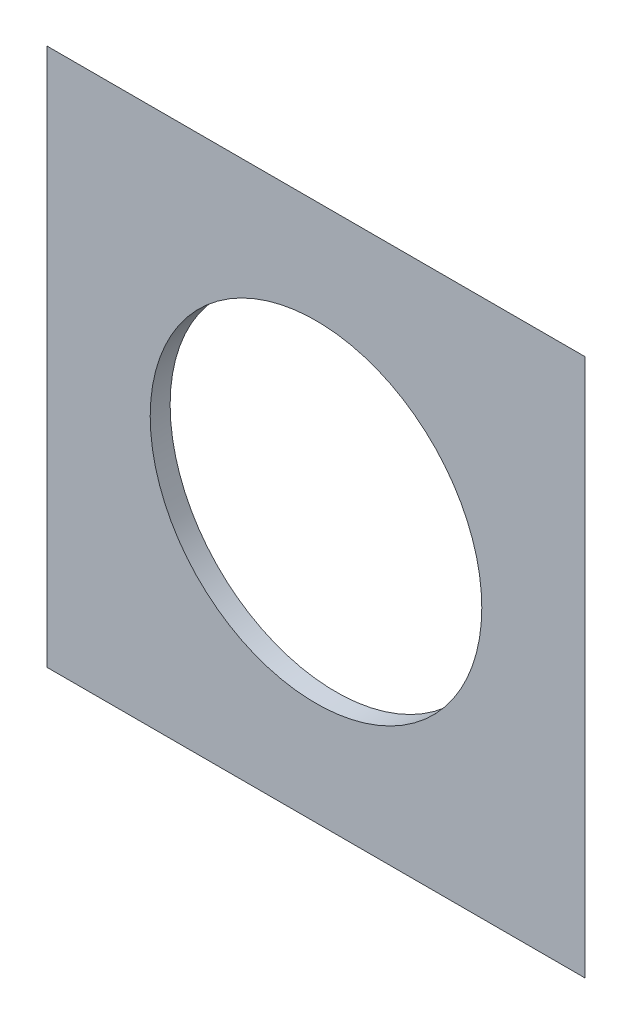
ISO-10303-21;
HEADER;
FILE_DESCRIPTION(('STEP AP214'),'2;1');
FILE_NAME('part.step','',(''),(''),'','','');
FILE_SCHEMA(('AUTOMOTIVE_DESIGN { 1 0 10303 214 1 1 1 1 }'));
ENDSEC;
DATA;
#1=APPLICATION_CONTEXT('core data for automotive mechanical design processes');
#2=APPLICATION_PROTOCOL_DEFINITION('international standard','automotive_design',2000,#1);
#3=PRODUCT_CONTEXT('',#1,'mechanical');
#4=PRODUCT('Part','Part','',(#3));
#5=PRODUCT_RELATED_PRODUCT_CATEGORY('part','',(#4));
#6=PRODUCT_DEFINITION_FORMATION('','',#4);
#7=PRODUCT_DEFINITION_CONTEXT('part definition',#1,'design');
#8=PRODUCT_DEFINITION('design','',#6,#7);
#9=PRODUCT_DEFINITION_SHAPE('','',#8);
#10=(LENGTH_UNIT() NAMED_UNIT(*) SI_UNIT(.MILLI.,.METRE.));
#11=(NAMED_UNIT(*) PLANE_ANGLE_UNIT() SI_UNIT($,.RADIAN.));
#12=(NAMED_UNIT(*) SI_UNIT($,.STERADIAN.) SOLID_ANGLE_UNIT());
#13=UNCERTAINTY_MEASURE_WITH_UNIT(LENGTH_MEASURE(1.E-05),#10,'distance_accuracy_value','');
#14=(GEOMETRIC_REPRESENTATION_CONTEXT(3) GLOBAL_UNCERTAINTY_ASSIGNED_CONTEXT((#13)) GLOBAL_UNIT_ASSIGNED_CONTEXT((#10,
#11,#12)) REPRESENTATION_CONTEXT('',''));
#15=CARTESIAN_POINT('',(0.,0.,0.));
#16=DIRECTION('',(0.,0.,1.));
#17=DIRECTION('',(1.,0.,0.));
#18=AXIS2_PLACEMENT_3D('',#15,#16,#17);
#19=CARTESIAN_POINT('',(-171.45,171.45,0.));
#20=DIRECTION('',(-0.707106781186546,0.,-0.707106781186549));
#21=DIRECTION('',(-0.707106781186549,0.,0.707106781186546));
#22=AXIS2_PLACEMENT_3D('',#19,#20,#21);
#23=PLANE('',#22);
#24=DIRECTION('',(0.,-1.,0.));
#25=VECTOR('',#24,1.);
#26=CARTESIAN_POINT('',(-171.45,171.45,0.));
#27=LINE('',#26,#25);
#28=CARTESIAN_POINT('',(-171.45,171.45,0.));
#29=VERTEX_POINT('',#28);
#30=CARTESIAN_POINT('',(-171.45,-171.45,0.));
#31=VERTEX_POINT('',#30);
#32=EDGE_CURVE('E201',#29,#31,#27,.T.);
#33=ORIENTED_EDGE('',*,*,#32,.F.);
#34=DIRECTION('',(-0.577350269189627,0.577350269189627,0.577350269189624));
#35=VECTOR('',#34,1.);
#36=CARTESIAN_POINT('',(-171.45,171.45,0.));
#37=LINE('',#36,#35);
#38=CARTESIAN_POINT('',(-158.75,158.75,-12.7));
#39=VERTEX_POINT('',#38);
#40=EDGE_CURVE('E11',#39,#29,#37,.T.);
#41=ORIENTED_EDGE('',*,*,#40,.F.);
#42=DIRECTION('',(0.,-1.,0.));
#43=VECTOR('',#42,1.);
#44=CARTESIAN_POINT('',(-158.75,0.,-12.7));
#45=LINE('',#44,#43);
#46=CARTESIAN_POINT('',(-158.75,-158.75,-12.7));
#47=VERTEX_POINT('',#46);
#48=EDGE_CURVE('E214',#39,#47,#45,.T.);
#49=ORIENTED_EDGE('',*,*,#48,.T.);
#50=DIRECTION('',(-0.577350269189626,-0.577350269189627,0.577350269189624));
#51=VECTOR('',#50,1.);
#52=CARTESIAN_POINT('',(-57.15,-57.1499999999997,-114.3));
#53=LINE('',#52,#51);
#54=EDGE_CURVE('E216',#47,#31,#53,.T.);
#55=ORIENTED_EDGE('',*,*,#54,.T.);
#56=EDGE_LOOP('',(#33,#41,#49,#55));
#57=FACE_BOUND('',#56,.T.);
#58=ADVANCED_FACE('F39',(#57),#23,.T.);
#59=CARTESIAN_POINT('',(-171.45,171.45,0.));
#60=DIRECTION('',(0.,0.707106781186546,-0.707106781186549));
#61=DIRECTION('',(0.,0.707106781186549,0.707106781186546));
#62=AXIS2_PLACEMENT_3D('',#59,#60,#61);
#63=PLANE('',#62);
#64=DIRECTION('',(-1.,0.,0.));
#65=VECTOR('',#64,1.);
#66=CARTESIAN_POINT('',(-171.45,171.45,0.));
#67=LINE('',#66,#65);
#68=CARTESIAN_POINT('',(171.45,171.45,0.));
#69=VERTEX_POINT('',#68);
#70=EDGE_CURVE('E212',#69,#29,#67,.T.);
#71=ORIENTED_EDGE('',*,*,#70,.F.);
#72=DIRECTION('',(0.577350269189626,0.577350269189627,0.577350269189624));
#73=VECTOR('',#72,1.);
#74=CARTESIAN_POINT('',(171.45,171.45,0.));
#75=LINE('',#74,#73);
#76=CARTESIAN_POINT('',(158.75,158.75,-12.7));
#77=VERTEX_POINT('',#76);
#78=EDGE_CURVE('E48',#77,#69,#75,.T.);
#79=ORIENTED_EDGE('',*,*,#78,.F.);
#80=DIRECTION('',(-1.,0.,0.));
#81=VECTOR('',#80,1.);
#82=CARTESIAN_POINT('',(0.,158.75,-12.7));
#83=LINE('',#82,#81);
#84=EDGE_CURVE('E219',#77,#39,#83,.T.);
#85=ORIENTED_EDGE('',*,*,#84,.T.);
#86=ORIENTED_EDGE('',*,*,#40,.T.);
#87=EDGE_LOOP('',(#71,#79,#85,#86));
#88=FACE_BOUND('',#87,.T.);
#89=ADVANCED_FACE('F41',(#88),#63,.T.);
#90=CARTESIAN_POINT('',(171.45,171.45,0.));
#91=DIRECTION('',(0.707106781186546,0.,-0.707106781186549));
#92=DIRECTION('',(-0.707106781186549,0.,-0.707106781186546));
#93=AXIS2_PLACEMENT_3D('',#90,#91,#92);
#94=PLANE('',#93);
#95=DIRECTION('',(0.,1.,0.));
#96=VECTOR('',#95,1.);
#97=CARTESIAN_POINT('',(171.45,171.45,0.));
#98=LINE('',#97,#96);
#99=CARTESIAN_POINT('',(171.45,-171.45,0.));
#100=VERTEX_POINT('',#99);
#101=EDGE_CURVE('E209',#100,#69,#98,.T.);
#102=ORIENTED_EDGE('',*,*,#101,.F.);
#103=DIRECTION('',(0.577350269189627,-0.577350269189627,0.577350269189624));
#104=VECTOR('',#103,1.);
#105=CARTESIAN_POINT('',(57.1499999999999,-57.1499999999994,-114.3));
#106=LINE('',#105,#104);
#107=CARTESIAN_POINT('',(158.75,-158.75,-12.7));
#108=VERTEX_POINT('',#107);
#109=EDGE_CURVE('E218',#108,#100,#106,.T.);
#110=ORIENTED_EDGE('',*,*,#109,.F.);
#111=DIRECTION('',(0.,1.,0.));
#112=VECTOR('',#111,1.);
#113=CARTESIAN_POINT('',(158.75,0.,-12.7));
#114=LINE('',#113,#112);
#115=EDGE_CURVE('E225',#108,#77,#114,.T.);
#116=ORIENTED_EDGE('',*,*,#115,.T.);
#117=ORIENTED_EDGE('',*,*,#78,.T.);
#118=EDGE_LOOP('',(#102,#110,#116,#117));
#119=FACE_BOUND('',#118,.T.);
#120=ADVANCED_FACE('F243',(#119),#94,.T.);
#121=CARTESIAN_POINT('',(-171.45,-171.45,0.));
#122=DIRECTION('',(0.,-0.707106781186546,-0.707106781186549));
#123=DIRECTION('',(0.,0.707106781186549,-0.707106781186546));
#124=AXIS2_PLACEMENT_3D('',#121,#122,#123);
#125=PLANE('',#124);
#126=DIRECTION('',(1.,0.,0.));
#127=VECTOR('',#126,1.);
#128=CARTESIAN_POINT('',(-171.45,-171.45,0.));
#129=LINE('',#128,#127);
#130=EDGE_CURVE('E206',#31,#100,#129,.T.);
#131=ORIENTED_EDGE('',*,*,#130,.F.);
#132=ORIENTED_EDGE('',*,*,#54,.F.);
#133=DIRECTION('',(1.,0.,0.));
#134=VECTOR('',#133,1.);
#135=CARTESIAN_POINT('',(0.,-158.75,-12.7));
#136=LINE('',#135,#134);
#137=EDGE_CURVE('E43',#47,#108,#136,.T.);
#138=ORIENTED_EDGE('',*,*,#137,.T.);
#139=ORIENTED_EDGE('',*,*,#109,.T.);
#140=EDGE_LOOP('',(#131,#132,#138,#139));
#141=FACE_BOUND('',#140,.T.);
#142=ADVANCED_FACE('F234',(#141),#125,.T.);
#143=CARTESIAN_POINT('',(0.,0.,-12.7));
#144=DIRECTION('',(0.,0.,1.));
#145=DIRECTION('',(1.,0.,0.));
#146=AXIS2_PLACEMENT_3D('',#143,#144,#145);
#147=PLANE('',#146);
#148=DIRECTION('',(-0.707106781186549,0.707106781186546,0.));
#149=VECTOR('',#148,1.);
#150=CARTESIAN_POINT('',(145.166928511667,18.632943136635,-12.7));
#151=LINE('',#150,#149);
#152=CARTESIAN_POINT('',(145.166928511667,18.632943136635,-12.7));
#153=VERTEX_POINT('',#152);
#154=CARTESIAN_POINT('',(18.6329431366339,145.166928511667,-12.7));
#155=VERTEX_POINT('',#154);
#156=EDGE_CURVE('E158',#153,#155,#151,.T.);
#157=ORIENTED_EDGE('',*,*,#156,.F.);
#158=CARTESIAN_POINT('',(149.926464255833,23.3924788808017,-12.7));
#159=DIRECTION('',(0.,0.,-1.));
#160=DIRECTION('',(1.,0.,0.));
#161=AXIS2_PLACEMENT_3D('',#158,#159,#160);
#162=CIRCLE('',#161,6.73099999999998);
#163=CARTESIAN_POINT('',(154.686,28.1520146249683,-12.7));
#164=VERTEX_POINT('',#163);
#165=EDGE_CURVE('E56',#164,#153,#162,.T.);
#166=ORIENTED_EDGE('',*,*,#165,.F.);
#167=DIRECTION('',(0.707106781186549,-0.707106781186546,0.));
#168=VECTOR('',#167,1.);
#169=CARTESIAN_POINT('',(154.686,28.1520146249683,-12.7));
#170=LINE('',#169,#168);
#171=CARTESIAN_POINT('',(28.1520146249672,154.686,-12.7));
#172=VERTEX_POINT('',#171);
#173=EDGE_CURVE('E149',#172,#164,#170,.T.);
#174=ORIENTED_EDGE('',*,*,#173,.F.);
#175=CARTESIAN_POINT('',(23.3924788808006,149.926464255834,-12.7));
#176=DIRECTION('',(0.,0.,-1.));
#177=DIRECTION('',(-1.,0.,0.));
#178=AXIS2_PLACEMENT_3D('',#175,#176,#177);
#179=CIRCLE('',#178,6.73099999999999);
#180=EDGE_CURVE('E152',#155,#172,#179,.T.);
#181=ORIENTED_EDGE('',*,*,#180,.F.);
#182=EDGE_LOOP('',(#157,#166,#174,#181));
#183=FACE_BOUND('',#182,.T.);
#184=DIRECTION('',(0.707106781186547,-0.707106781186548,0.));
#185=VECTOR('',#184,1.);
#186=CARTESIAN_POINT('',(-18.6329431366346,-145.166928511667,-12.7));
#187=LINE('',#186,#185);
#188=CARTESIAN_POINT('',(-145.166928511667,-18.6329431366342,-12.7));
#189=VERTEX_POINT('',#188);
#190=CARTESIAN_POINT('',(-18.6329431366346,-145.166928511667,-12.7));
#191=VERTEX_POINT('',#190);
#192=EDGE_CURVE('E184',#189,#191,#187,.T.);
#193=ORIENTED_EDGE('',*,*,#192,.F.);
#194=CARTESIAN_POINT('',(-149.926464255834,-23.3924788808008,-12.7));
#195=DIRECTION('',(0.,0.,-1.));
#196=DIRECTION('',(1.,0.,0.));
#197=AXIS2_PLACEMENT_3D('',#194,#195,#196);
#198=CIRCLE('',#197,6.731);
#199=CARTESIAN_POINT('',(-154.686,-28.1520146249675,-12.7));
#200=VERTEX_POINT('',#199);
#201=EDGE_CURVE('E64',#200,#189,#198,.T.);
#202=ORIENTED_EDGE('',*,*,#201,.F.);
#203=DIRECTION('',(-0.707106781186548,0.707106781186547,0.));
#204=VECTOR('',#203,1.);
#205=CARTESIAN_POINT('',(-28.1520146249679,-154.686,-12.7));
#206=LINE('',#205,#204);
#207=CARTESIAN_POINT('',(-28.1520146249678,-154.686,-12.7));
#208=VERTEX_POINT('',#207);
#209=EDGE_CURVE('E177',#208,#200,#206,.T.);
#210=ORIENTED_EDGE('',*,*,#209,.F.);
#211=CARTESIAN_POINT('',(-23.3924788808012,-149.926464255833,-12.7));
#212=DIRECTION('',(0.,0.,-1.));
#213=DIRECTION('',(-1.,0.,0.));
#214=AXIS2_PLACEMENT_3D('',#211,#212,#213);
#215=CIRCLE('',#214,6.73099999999998);
#216=EDGE_CURVE('E180',#191,#208,#215,.T.);
#217=ORIENTED_EDGE('',*,*,#216,.F.);
#218=EDGE_LOOP('',(#193,#202,#210,#217));
#219=FACE_BOUND('',#218,.T.);
#220=CARTESIAN_POINT('',(0.,0.,-12.7));
#221=DIRECTION('',(0.,0.,-1.));
#222=DIRECTION('',(-1.,0.,0.));
#223=AXIS2_PLACEMENT_3D('',#220,#221,#222);
#224=CIRCLE('',#223,105.653774546973);
#225=CARTESIAN_POINT('',(-105.653774546973,0.,-12.7));
#226=VERTEX_POINT('',#225);
#227=EDGE_CURVE('E164',#226,#226,#224,.T.);
#228=ORIENTED_EDGE('',*,*,#227,.F.);
#229=EDGE_LOOP('',(#228));
#230=FACE_BOUND('',#229,.T.);
#231=ORIENTED_EDGE('',*,*,#48,.F.);
#232=ORIENTED_EDGE('',*,*,#84,.F.);
#233=ORIENTED_EDGE('',*,*,#115,.F.);
#234=ORIENTED_EDGE('',*,*,#137,.F.);
#235=EDGE_LOOP('',(#231,#232,#233,#234));
#236=FACE_BOUND('',#235,.T.);
#237=ADVANCED_FACE('F238',(#183,#219,#230,#236),#147,.F.);
#238=CARTESIAN_POINT('',(0.,0.,0.));
#239=DIRECTION('',(0.,0.,1.));
#240=DIRECTION('',(1.,0.,0.));
#241=AXIS2_PLACEMENT_3D('',#238,#239,#240);
#242=PLANE('',#241);
#243=CARTESIAN_POINT('',(0.,0.,0.));
#244=DIRECTION('',(0.,0.,-1.));
#245=DIRECTION('',(-1.,0.,0.));
#246=AXIS2_PLACEMENT_3D('',#243,#244,#245);
#247=CIRCLE('',#246,105.653774546973);
#248=CARTESIAN_POINT('',(-105.653774546973,0.,0.));
#249=VERTEX_POINT('',#248);
#250=EDGE_CURVE('E198',#249,#249,#247,.T.);
#251=ORIENTED_EDGE('',*,*,#250,.T.);
#252=EDGE_LOOP('',(#251));
#253=FACE_BOUND('',#252,.T.);
#254=ORIENTED_EDGE('',*,*,#32,.T.);
#255=ORIENTED_EDGE('',*,*,#130,.T.);
#256=ORIENTED_EDGE('',*,*,#101,.T.);
#257=ORIENTED_EDGE('',*,*,#70,.T.);
#258=EDGE_LOOP('',(#254,#255,#256,#257));
#259=FACE_BOUND('',#258,.T.);
#260=ADVANCED_FACE('F245',(#253,#259),#242,.T.);
#261=CARTESIAN_POINT('',(0.,0.,0.));
#262=DIRECTION('',(0.,0.,-1.));
#263=DIRECTION('',(-1.,0.,0.));
#264=AXIS2_PLACEMENT_3D('',#261,#262,#263);
#265=CYLINDRICAL_SURFACE('',#264,105.653774546973);
#266=ORIENTED_EDGE('',*,*,#250,.F.);
#267=EDGE_LOOP('',(#266));
#268=FACE_BOUND('',#267,.T.);
#269=ORIENTED_EDGE('',*,*,#227,.T.);
#270=EDGE_LOOP('',(#269));
#271=FACE_BOUND('',#270,.T.);
#272=ADVANCED_FACE('F247',(#268,#271),#265,.F.);
#273=CARTESIAN_POINT('',(-149.926464255834,-23.3924788808008,-7.62));
#274=DIRECTION('',(0.,0.,-1.));
#275=DIRECTION('',(-1.,0.,0.));
#276=AXIS2_PLACEMENT_3D('',#273,#274,#275);
#277=CYLINDRICAL_SURFACE('',#276,6.731);
#278=ORIENTED_EDGE('',*,*,#201,.T.);
#279=DIRECTION('',(0.,0.,-1.));
#280=VECTOR('',#279,1.);
#281=CARTESIAN_POINT('',(-145.166928511667,-18.6329431366342,-7.62));
#282=LINE('',#281,#280);
#283=CARTESIAN_POINT('',(-145.166928511667,-18.6329431366342,-7.62));
#284=VERTEX_POINT('',#283);
#285=EDGE_CURVE('E168',#284,#189,#282,.T.);
#286=ORIENTED_EDGE('',*,*,#285,.F.);
#287=CARTESIAN_POINT('',(-149.926464255834,-23.3924788808008,-7.62));
#288=DIRECTION('',(0.,0.,-1.));
#289=DIRECTION('',(1.,0.,0.));
#290=AXIS2_PLACEMENT_3D('',#287,#288,#289);
#291=CIRCLE('',#290,6.731);
#292=CARTESIAN_POINT('',(-154.686,-28.1520146249675,-7.62));
#293=VERTEX_POINT('',#292);
#294=EDGE_CURVE('E181',#293,#284,#291,.T.);
#295=ORIENTED_EDGE('',*,*,#294,.F.);
#296=DIRECTION('',(0.,0.,-1.));
#297=VECTOR('',#296,1.);
#298=CARTESIAN_POINT('',(-154.686,-28.1520146249675,-7.62));
#299=LINE('',#298,#297);
#300=EDGE_CURVE('E175',#293,#200,#299,.T.);
#301=ORIENTED_EDGE('',*,*,#300,.T.);
#302=EDGE_LOOP('',(#278,#286,#295,#301));
#303=FACE_BOUND('',#302,.T.);
#304=ADVANCED_FACE('F254',(#303),#277,.F.);
#305=CARTESIAN_POINT('',(-28.1520146249679,-154.686,-7.62));
#306=DIRECTION('',(-0.707106781186547,-0.707106781186548,0.));
#307=DIRECTION('',(0.707106781186548,-0.707106781186547,0.));
#308=AXIS2_PLACEMENT_3D('',#305,#306,#307);
#309=PLANE('',#308);
#310=ORIENTED_EDGE('',*,*,#209,.T.);
#311=ORIENTED_EDGE('',*,*,#300,.F.);
#312=DIRECTION('',(-0.707106781186548,0.707106781186547,0.));
#313=VECTOR('',#312,1.);
#314=CARTESIAN_POINT('',(-28.1520146249679,-154.686,-7.62));
#315=LINE('',#314,#313);
#316=CARTESIAN_POINT('',(-28.1520146249678,-154.686,-7.62));
#317=VERTEX_POINT('',#316);
#318=EDGE_CURVE('E170',#317,#293,#315,.T.);
#319=ORIENTED_EDGE('',*,*,#318,.F.);
#320=DIRECTION('',(0.,0.,-1.));
#321=VECTOR('',#320,1.);
#322=CARTESIAN_POINT('',(-28.1520146249678,-154.686,-7.62));
#323=LINE('',#322,#321);
#324=EDGE_CURVE('E173',#317,#208,#323,.T.);
#325=ORIENTED_EDGE('',*,*,#324,.T.);
#326=EDGE_LOOP('',(#310,#311,#319,#325));
#327=FACE_BOUND('',#326,.T.);
#328=ADVANCED_FACE('F302',(#327),#309,.F.);
#329=CARTESIAN_POINT('',(-23.3924788808012,-149.926464255833,-7.62));
#330=DIRECTION('',(0.,0.,-1.));
#331=DIRECTION('',(-1.,0.,0.));
#332=AXIS2_PLACEMENT_3D('',#329,#330,#331);
#333=CYLINDRICAL_SURFACE('',#332,6.73099999999998);
#334=ORIENTED_EDGE('',*,*,#216,.T.);
#335=ORIENTED_EDGE('',*,*,#324,.F.);
#336=CARTESIAN_POINT('',(-23.3924788808012,-149.926464255833,-7.62));
#337=DIRECTION('',(0.,0.,-1.));
#338=DIRECTION('',(-1.,0.,0.));
#339=AXIS2_PLACEMENT_3D('',#336,#337,#338);
#340=CIRCLE('',#339,6.73099999999998);
#341=CARTESIAN_POINT('',(-18.6329431366346,-145.166928511667,-7.62));
#342=VERTEX_POINT('',#341);
#343=EDGE_CURVE('E190',#342,#317,#340,.T.);
#344=ORIENTED_EDGE('',*,*,#343,.F.);
#345=DIRECTION('',(0.,0.,-1.));
#346=VECTOR('',#345,1.);
#347=CARTESIAN_POINT('',(-18.6329431366346,-145.166928511667,-7.62));
#348=LINE('',#347,#346);
#349=EDGE_CURVE('E171',#342,#191,#348,.T.);
#350=ORIENTED_EDGE('',*,*,#349,.T.);
#351=EDGE_LOOP('',(#334,#335,#344,#350));
#352=FACE_BOUND('',#351,.T.);
#353=ADVANCED_FACE('F311',(#352),#333,.F.);
#354=CARTESIAN_POINT('',(-18.6329431366346,-145.166928511667,-7.62));
#355=DIRECTION('',(0.707106781186548,0.707106781186547,0.));
#356=DIRECTION('',(-0.707106781186547,0.707106781186548,0.));
#357=AXIS2_PLACEMENT_3D('',#354,#355,#356);
#358=PLANE('',#357);
#359=ORIENTED_EDGE('',*,*,#192,.T.);
#360=ORIENTED_EDGE('',*,*,#349,.F.);
#361=DIRECTION('',(0.707106781186547,-0.707106781186548,0.));
#362=VECTOR('',#361,1.);
#363=CARTESIAN_POINT('',(-18.6329431366346,-145.166928511667,-7.62));
#364=LINE('',#363,#362);
#365=EDGE_CURVE('E193',#284,#342,#364,.T.);
#366=ORIENTED_EDGE('',*,*,#365,.F.);
#367=ORIENTED_EDGE('',*,*,#285,.T.);
#368=EDGE_LOOP('',(#359,#360,#366,#367));
#369=FACE_BOUND('',#368,.T.);
#370=ADVANCED_FACE('F321',(#369),#358,.F.);
#371=CARTESIAN_POINT('',(-149.926464255834,-23.3924788808008,-7.62));
#372=DIRECTION('',(0.,0.,1.));
#373=DIRECTION('',(1.,0.,0.));
#374=AXIS2_PLACEMENT_3D('',#371,#372,#373);
#375=PLANE('',#374);
#376=ORIENTED_EDGE('',*,*,#294,.T.);
#377=ORIENTED_EDGE('',*,*,#365,.T.);
#378=ORIENTED_EDGE('',*,*,#343,.T.);
#379=ORIENTED_EDGE('',*,*,#318,.T.);
#380=EDGE_LOOP('',(#376,#377,#378,#379));
#381=FACE_BOUND('',#380,.T.);
#382=ADVANCED_FACE('F331',(#381),#375,.F.);
#383=CARTESIAN_POINT('',(149.926464255833,23.3924788808017,-7.62));
#384=DIRECTION('',(0.,0.,-1.));
#385=DIRECTION('',(-1.,0.,0.));
#386=AXIS2_PLACEMENT_3D('',#383,#384,#385);
#387=CYLINDRICAL_SURFACE('',#386,6.73099999999998);
#388=ORIENTED_EDGE('',*,*,#165,.T.);
#389=DIRECTION('',(0.,0.,-1.));
#390=VECTOR('',#389,1.);
#391=CARTESIAN_POINT('',(145.166928511667,18.632943136635,-7.62));
#392=LINE('',#391,#390);
#393=CARTESIAN_POINT('',(145.166928511667,18.632943136635,-7.62));
#394=VERTEX_POINT('',#393);
#395=EDGE_CURVE('E127',#394,#153,#392,.T.);
#396=ORIENTED_EDGE('',*,*,#395,.F.);
#397=CARTESIAN_POINT('',(149.926464255833,23.3924788808017,-7.62));
#398=DIRECTION('',(0.,0.,-1.));
#399=DIRECTION('',(1.,0.,0.));
#400=AXIS2_PLACEMENT_3D('',#397,#398,#399);
#401=CIRCLE('',#400,6.73099999999998);
#402=CARTESIAN_POINT('',(154.686,28.1520146249683,-7.62));
#403=VERTEX_POINT('',#402);
#404=EDGE_CURVE('E131',#403,#394,#401,.T.);
#405=ORIENTED_EDGE('',*,*,#404,.F.);
#406=DIRECTION('',(0.,0.,-1.));
#407=VECTOR('',#406,1.);
#408=CARTESIAN_POINT('',(154.686,28.1520146249683,-7.62));
#409=LINE('',#408,#407);
#410=EDGE_CURVE('E162',#403,#164,#409,.T.);
#411=ORIENTED_EDGE('',*,*,#410,.T.);
#412=EDGE_LOOP('',(#388,#396,#405,#411));
#413=FACE_BOUND('',#412,.T.);
#414=ADVANCED_FACE('F129',(#413),#387,.F.);
#415=CARTESIAN_POINT('',(154.686,28.1520146249683,-7.62));
#416=DIRECTION('',(0.707106781186546,0.707106781186549,0.));
#417=DIRECTION('',(-0.707106781186549,0.707106781186546,0.));
#418=AXIS2_PLACEMENT_3D('',#415,#416,#417);
#419=PLANE('',#418);
#420=ORIENTED_EDGE('',*,*,#173,.T.);
#421=ORIENTED_EDGE('',*,*,#410,.F.);
#422=DIRECTION('',(0.707106781186549,-0.707106781186546,0.));
#423=VECTOR('',#422,1.);
#424=CARTESIAN_POINT('',(154.686,28.1520146249683,-7.62));
#425=LINE('',#424,#423);
#426=CARTESIAN_POINT('',(28.1520146249672,154.686,-7.62));
#427=VERTEX_POINT('',#426);
#428=EDGE_CURVE('E137',#427,#403,#425,.T.);
#429=ORIENTED_EDGE('',*,*,#428,.F.);
#430=DIRECTION('',(0.,0.,-1.));
#431=VECTOR('',#430,1.);
#432=CARTESIAN_POINT('',(28.1520146249672,154.686,-7.62));
#433=LINE('',#432,#431);
#434=EDGE_CURVE('E165',#427,#172,#433,.T.);
#435=ORIENTED_EDGE('',*,*,#434,.T.);
#436=EDGE_LOOP('',(#420,#421,#429,#435));
#437=FACE_BOUND('',#436,.T.);
#438=ADVANCED_FACE('F350',(#437),#419,.F.);
#439=CARTESIAN_POINT('',(23.3924788808006,149.926464255834,-7.62));
#440=DIRECTION('',(0.,0.,-1.));
#441=DIRECTION('',(-1.,0.,0.));
#442=AXIS2_PLACEMENT_3D('',#439,#440,#441);
#443=CYLINDRICAL_SURFACE('',#442,6.73099999999999);
#444=ORIENTED_EDGE('',*,*,#180,.T.);
#445=ORIENTED_EDGE('',*,*,#434,.F.);
#446=CARTESIAN_POINT('',(23.3924788808006,149.926464255834,-7.62));
#447=DIRECTION('',(0.,0.,-1.));
#448=DIRECTION('',(-1.,0.,0.));
#449=AXIS2_PLACEMENT_3D('',#446,#447,#448);
#450=CIRCLE('',#449,6.73099999999999);
#451=CARTESIAN_POINT('',(18.6329431366339,145.166928511667,-7.62));
#452=VERTEX_POINT('',#451);
#453=EDGE_CURVE('E145',#452,#427,#450,.T.);
#454=ORIENTED_EDGE('',*,*,#453,.F.);
#455=DIRECTION('',(0.,0.,-1.));
#456=VECTOR('',#455,1.);
#457=CARTESIAN_POINT('',(18.6329431366339,145.166928511667,-7.62));
#458=LINE('',#457,#456);
#459=EDGE_CURVE('E136',#452,#155,#458,.T.);
#460=ORIENTED_EDGE('',*,*,#459,.T.);
#461=EDGE_LOOP('',(#444,#445,#454,#460));
#462=FACE_BOUND('',#461,.T.);
#463=ADVANCED_FACE('F359',(#462),#443,.F.);
#464=CARTESIAN_POINT('',(145.166928511667,18.632943136635,-7.62));
#465=DIRECTION('',(-0.707106781186546,-0.707106781186549,0.));
#466=DIRECTION('',(0.707106781186549,-0.707106781186546,0.));
#467=AXIS2_PLACEMENT_3D('',#464,#465,#466);
#468=PLANE('',#467);
#469=ORIENTED_EDGE('',*,*,#156,.T.);
#470=ORIENTED_EDGE('',*,*,#459,.F.);
#471=DIRECTION('',(-0.707106781186549,0.707106781186546,0.));
#472=VECTOR('',#471,1.);
#473=CARTESIAN_POINT('',(145.166928511667,18.632943136635,-7.62));
#474=LINE('',#473,#472);
#475=EDGE_CURVE('E140',#394,#452,#474,.T.);
#476=ORIENTED_EDGE('',*,*,#475,.F.);
#477=ORIENTED_EDGE('',*,*,#395,.T.);
#478=EDGE_LOOP('',(#469,#470,#476,#477));
#479=FACE_BOUND('',#478,.T.);
#480=ADVANCED_FACE('F141',(#479),#468,.F.);
#481=CARTESIAN_POINT('',(149.926464255833,23.3924788808017,-7.62));
#482=DIRECTION('',(0.,0.,1.));
#483=DIRECTION('',(1.,0.,0.));
#484=AXIS2_PLACEMENT_3D('',#481,#482,#483);
#485=PLANE('',#484);
#486=ORIENTED_EDGE('',*,*,#404,.T.);
#487=ORIENTED_EDGE('',*,*,#475,.T.);
#488=ORIENTED_EDGE('',*,*,#453,.T.);
#489=ORIENTED_EDGE('',*,*,#428,.T.);
#490=EDGE_LOOP('',(#486,#487,#488,#489));
#491=FACE_BOUND('',#490,.T.);
#492=ADVANCED_FACE('F147',(#491),#485,.F.);
#493=CLOSED_SHELL('',(#58,#89,#120,#142,#237,#260,#272,#304,#328,#353,#370,#382,#414,#438,#463,
#480,#492));
#494=MANIFOLD_SOLID_BREP('B2',#493);
#495=ADVANCED_BREP_SHAPE_REPRESENTATION('',(#18,#494),#14);
#496=SHAPE_DEFINITION_REPRESENTATION(#9,#495);
ENDSEC;
END-ISO-10303-21;
